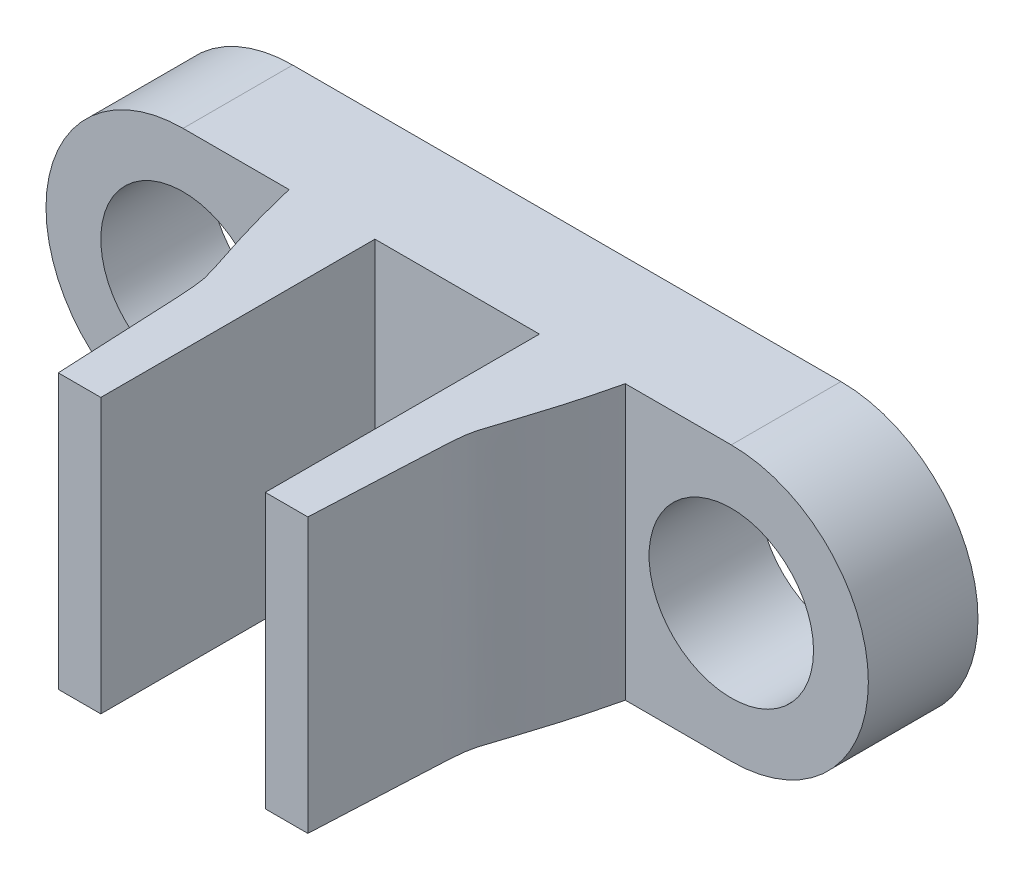
ISO-10303-21;
HEADER;
FILE_DESCRIPTION(('STEP AP214'),'2;1');
FILE_NAME('part.step','',(''),(''),'','','');
FILE_SCHEMA(('AUTOMOTIVE_DESIGN { 1 0 10303 214 1 1 1 1 }'));
ENDSEC;
DATA;
#1=APPLICATION_CONTEXT('core data for automotive mechanical design processes');
#2=APPLICATION_PROTOCOL_DEFINITION('international standard','automotive_design',2000,#1);
#3=PRODUCT_CONTEXT('',#1,'mechanical');
#4=PRODUCT('Part','Part','',(#3));
#5=PRODUCT_RELATED_PRODUCT_CATEGORY('part','',(#4));
#6=PRODUCT_DEFINITION_FORMATION('','',#4);
#7=PRODUCT_DEFINITION_CONTEXT('part definition',#1,'design');
#8=PRODUCT_DEFINITION('design','',#6,#7);
#9=PRODUCT_DEFINITION_SHAPE('','',#8);
#10=(LENGTH_UNIT() NAMED_UNIT(*) SI_UNIT(.MILLI.,.METRE.));
#11=(NAMED_UNIT(*) PLANE_ANGLE_UNIT() SI_UNIT($,.RADIAN.));
#12=(NAMED_UNIT(*) SI_UNIT($,.STERADIAN.) SOLID_ANGLE_UNIT());
#13=UNCERTAINTY_MEASURE_WITH_UNIT(LENGTH_MEASURE(1.E-05),#10,'distance_accuracy_value','');
#14=(GEOMETRIC_REPRESENTATION_CONTEXT(3) GLOBAL_UNCERTAINTY_ASSIGNED_CONTEXT((#13)) GLOBAL_UNIT_ASSIGNED_CONTEXT((#10,
#11,#12)) REPRESENTATION_CONTEXT('',''));
#15=CARTESIAN_POINT('',(0.,0.,0.));
#16=DIRECTION('',(0.,0.,1.));
#17=DIRECTION('',(1.,0.,0.));
#18=AXIS2_PLACEMENT_3D('',#15,#16,#17);
#19=CARTESIAN_POINT('',(5.,-9.93979523248615,2.));
#20=DIRECTION('',(0.,0.,1.));
#21=DIRECTION('',(1.,0.,0.));
#22=AXIS2_PLACEMENT_3D('',#19,#20,#21);
#23=PLANE('',#22);
#24=CARTESIAN_POINT('',(10.,2.5,2.));
#25=DIRECTION('',(0.,0.,1.));
#26=DIRECTION('',(1.,0.,0.));
#27=AXIS2_PLACEMENT_3D('',#24,#25,#26);
#28=CIRCLE('',#27,1.5);
#29=CARTESIAN_POINT('',(11.5,2.5,2.));
#30=VERTEX_POINT('',#29);
#31=EDGE_CURVE('E196',#30,#30,#28,.F.);
#32=ORIENTED_EDGE('',*,*,#31,.T.);
#33=EDGE_LOOP('',(#32));
#34=FACE_BOUND('',#33,.T.);
#35=DIRECTION('',(1.,0.,0.));
#36=VECTOR('',#35,1.);
#37=CARTESIAN_POINT('',(5.,5.,2.));
#38=LINE('',#37,#36);
#39=CARTESIAN_POINT('',(8.06674551606634,5.,2.));
#40=VERTEX_POINT('',#39);
#41=CARTESIAN_POINT('',(10.,5.,2.));
#42=VERTEX_POINT('',#41);
#43=EDGE_CURVE('E35',#40,#42,#38,.T.);
#44=ORIENTED_EDGE('',*,*,#43,.F.);
#45=DIRECTION('',(0.,-1.,0.));
#46=VECTOR('',#45,1.);
#47=CARTESIAN_POINT('',(8.06674551606634,5.,2.));
#48=LINE('',#47,#46);
#49=CARTESIAN_POINT('',(8.06674551606634,0.,2.));
#50=VERTEX_POINT('',#49);
#51=EDGE_CURVE('E161',#40,#50,#48,.T.);
#52=ORIENTED_EDGE('',*,*,#51,.T.);
#53=DIRECTION('',(1.,0.,0.));
#54=VECTOR('',#53,1.);
#55=CARTESIAN_POINT('',(5.,0.,2.));
#56=LINE('',#55,#54);
#57=CARTESIAN_POINT('',(10.,0.,2.));
#58=VERTEX_POINT('',#57);
#59=EDGE_CURVE('E249',#50,#58,#56,.T.);
#60=ORIENTED_EDGE('',*,*,#59,.T.);
#61=CARTESIAN_POINT('',(10.,2.5,2.));
#62=DIRECTION('',(0.,0.,1.));
#63=DIRECTION('',(1.,0.,0.));
#64=AXIS2_PLACEMENT_3D('',#61,#62,#63);
#65=CIRCLE('',#64,2.5);
#66=EDGE_CURVE('E236',#42,#58,#65,.F.);
#67=ORIENTED_EDGE('',*,*,#66,.F.);
#68=EDGE_LOOP('',(#44,#52,#60,#67));
#69=FACE_BOUND('',#68,.T.);
#70=ADVANCED_FACE('F31',(#34,#69),#23,.T.);
#71=CARTESIAN_POINT('',(3.5,0.,2.));
#72=VERTEX_POINT('',#71);
#73=CARTESIAN_POINT('',(6.5,0.,2.));
#74=VERTEX_POINT('',#73);
#75=EDGE_CURVE('E243',#72,#74,#56,.T.);
#76=ORIENTED_EDGE('',*,*,#75,.T.);
#77=DIRECTION('',(0.,-1.,0.));
#78=VECTOR('',#77,1.);
#79=CARTESIAN_POINT('',(6.5,5.,2.));
#80=LINE('',#79,#78);
#81=CARTESIAN_POINT('',(6.5,5.,2.));
#82=VERTEX_POINT('',#81);
#83=EDGE_CURVE('E56',#82,#74,#80,.T.);
#84=ORIENTED_EDGE('',*,*,#83,.F.);
#85=CARTESIAN_POINT('',(3.5,5.,2.));
#86=VERTEX_POINT('',#85);
#87=EDGE_CURVE('E129',#86,#82,#38,.T.);
#88=ORIENTED_EDGE('',*,*,#87,.F.);
#89=DIRECTION('',(0.,-1.,0.));
#90=VECTOR('',#89,1.);
#91=CARTESIAN_POINT('',(3.5,5.,2.));
#92=LINE('',#91,#90);
#93=EDGE_CURVE('E484',#86,#72,#92,.T.);
#94=ORIENTED_EDGE('',*,*,#93,.T.);
#95=EDGE_LOOP('',(#76,#84,#88,#94));
#96=FACE_BOUND('',#95,.T.);
#97=ADVANCED_FACE('F307',(#96),#23,.T.);
#98=CARTESIAN_POINT('',(5.,5.,2.));
#99=DIRECTION('',(0.,1.,0.));
#100=DIRECTION('',(-1.,0.,0.));
#101=AXIS2_PLACEMENT_3D('',#98,#99,#100);
#102=PLANE('',#101);
#103=DIRECTION('',(1.,0.,0.));
#104=VECTOR('',#103,1.);
#105=CARTESIAN_POINT('',(5.,5.,0.));
#106=LINE('',#105,#104);
#107=CARTESIAN_POINT('',(0.,5.,0.));
#108=VERTEX_POINT('',#107);
#109=CARTESIAN_POINT('',(10.,5.,0.));
#110=VERTEX_POINT('',#109);
#111=EDGE_CURVE('E229',#108,#110,#106,.T.);
#112=ORIENTED_EDGE('',*,*,#111,.F.);
#113=DIRECTION('',(0.,0.,-1.));
#114=VECTOR('',#113,1.);
#115=CARTESIAN_POINT('',(0.,5.,2.));
#116=LINE('',#115,#114);
#117=CARTESIAN_POINT('',(0.,5.,2.));
#118=VERTEX_POINT('',#117);
#119=EDGE_CURVE('E11',#118,#108,#116,.T.);
#120=ORIENTED_EDGE('',*,*,#119,.F.);
#121=CARTESIAN_POINT('',(1.93325448393367,5.,2.));
#122=VERTEX_POINT('',#121);
#123=EDGE_CURVE('E208',#118,#122,#38,.T.);
#124=ORIENTED_EDGE('',*,*,#123,.T.);
#125=CARTESIAN_POINT('',(1.93325448393367,5.,2.));
#126=CARTESIAN_POINT('',(2.17639992563824,5.,3.02764553538287));
#127=CARTESIAN_POINT('',(2.4338956799412,5.,3.71384394415481));
#128=CARTESIAN_POINT('',(2.62684127220932,5.,4.3777778213624));
#129=CARTESIAN_POINT('',(2.62348273197585,5.,5.09649635879953));
#130=CARTESIAN_POINT('',(2.72371487900341,5.,7.));
#131=B_SPLINE_CURVE_WITH_KNOTS('',3,(#125,#126,#127,#128,#129,#130),.UNSPECIFIED.,.F.,.F.,(4,1,
1,4),(0.,0.529324460452344,0.629324460452344,1.),.UNSPECIFIED.);
#132=CARTESIAN_POINT('',(2.72371487900342,5.,7.));
#133=VERTEX_POINT('',#132);
#134=EDGE_CURVE('E179',#122,#133,#131,.T.);
#135=ORIENTED_EDGE('',*,*,#134,.T.);
#136=DIRECTION('',(1.,0.,0.));
#137=VECTOR('',#136,1.);
#138=CARTESIAN_POINT('',(2.72371487900342,5.,7.));
#139=LINE('',#138,#137);
#140=CARTESIAN_POINT('',(3.5,5.,7.));
#141=VERTEX_POINT('',#140);
#142=EDGE_CURVE('E168',#133,#141,#139,.T.);
#143=ORIENTED_EDGE('',*,*,#142,.T.);
#144=DIRECTION('',(0.,0.,-1.));
#145=VECTOR('',#144,1.);
#146=CARTESIAN_POINT('',(3.5,5.,2.));
#147=LINE('',#146,#145);
#148=EDGE_CURVE('E483',#141,#86,#147,.T.);
#149=ORIENTED_EDGE('',*,*,#148,.T.);
#150=ORIENTED_EDGE('',*,*,#87,.T.);
#151=DIRECTION('',(0.,0.,1.));
#152=VECTOR('',#151,1.);
#153=CARTESIAN_POINT('',(6.5,5.,2.));
#154=LINE('',#153,#152);
#155=CARTESIAN_POINT('',(6.5,5.,7.));
#156=VERTEX_POINT('',#155);
#157=EDGE_CURVE('E122',#82,#156,#154,.T.);
#158=ORIENTED_EDGE('',*,*,#157,.T.);
#159=DIRECTION('',(1.,0.,0.));
#160=VECTOR('',#159,1.);
#161=CARTESIAN_POINT('',(7.27628512099659,5.,7.));
#162=LINE('',#161,#160);
#163=CARTESIAN_POINT('',(7.27628512099659,5.,7.));
#164=VERTEX_POINT('',#163);
#165=EDGE_CURVE('E127',#156,#164,#162,.T.);
#166=ORIENTED_EDGE('',*,*,#165,.T.);
#167=CARTESIAN_POINT('',(7.27628512099659,5.,7.));
#168=CARTESIAN_POINT('',(7.37651726802416,5.,5.09649635879953));
#169=CARTESIAN_POINT('',(7.37315872779069,5.,4.3777778213624));
#170=CARTESIAN_POINT('',(7.5661043200588,5.,3.71384394415481));
#171=CARTESIAN_POINT('',(7.82360007436176,5.,3.02764553538287));
#172=CARTESIAN_POINT('',(8.06674551606634,5.,2.));
#173=B_SPLINE_CURVE_WITH_KNOTS('',3,(#167,#168,#169,#170,#171,#172),.UNSPECIFIED.,.F.,.F.,(4,1,
1,4),(0.,0.370675539547656,0.470675539547656,1.),.UNSPECIFIED.);
#174=EDGE_CURVE('E131',#164,#40,#173,.T.);
#175=ORIENTED_EDGE('',*,*,#174,.T.);
#176=ORIENTED_EDGE('',*,*,#43,.T.);
#177=DIRECTION('',(0.,0.,-1.));
#178=VECTOR('',#177,1.);
#179=CARTESIAN_POINT('',(10.,5.,2.));
#180=LINE('',#179,#178);
#181=EDGE_CURVE('E215',#42,#110,#180,.T.);
#182=ORIENTED_EDGE('',*,*,#181,.T.);
#183=EDGE_LOOP('',(#112,#120,#124,#135,#143,#149,#150,#158,#166,#175,#176,#182));
#184=FACE_BOUND('',#183,.T.);
#185=ADVANCED_FACE('F125',(#184),#102,.T.);
#186=CARTESIAN_POINT('',(0.,2.5,2.));
#187=DIRECTION('',(0.,0.,-1.));
#188=DIRECTION('',(-1.,0.,0.));
#189=AXIS2_PLACEMENT_3D('',#186,#187,#188);
#190=CYLINDRICAL_SURFACE('',#189,2.5);
#191=CARTESIAN_POINT('',(0.,2.5,0.));
#192=DIRECTION('',(0.,0.,1.));
#193=DIRECTION('',(1.,0.,0.));
#194=AXIS2_PLACEMENT_3D('',#191,#192,#193);
#195=CIRCLE('',#194,2.5);
#196=CARTESIAN_POINT('',(0.,0.,0.));
#197=VERTEX_POINT('',#196);
#198=EDGE_CURVE('E226',#108,#197,#195,.T.);
#199=ORIENTED_EDGE('',*,*,#198,.T.);
#200=DIRECTION('',(0.,0.,-1.));
#201=VECTOR('',#200,1.);
#202=CARTESIAN_POINT('',(0.,0.,2.));
#203=LINE('',#202,#201);
#204=CARTESIAN_POINT('',(0.,0.,2.));
#205=VERTEX_POINT('',#204);
#206=EDGE_CURVE('E41',#205,#197,#203,.T.);
#207=ORIENTED_EDGE('',*,*,#206,.F.);
#208=CARTESIAN_POINT('',(0.,2.5,2.));
#209=DIRECTION('',(0.,0.,1.));
#210=DIRECTION('',(1.,0.,0.));
#211=AXIS2_PLACEMENT_3D('',#208,#209,#210);
#212=CIRCLE('',#211,2.5);
#213=EDGE_CURVE('E201',#118,#205,#212,.T.);
#214=ORIENTED_EDGE('',*,*,#213,.F.);
#215=ORIENTED_EDGE('',*,*,#119,.T.);
#216=EDGE_LOOP('',(#199,#207,#214,#215));
#217=FACE_BOUND('',#216,.T.);
#218=ADVANCED_FACE('F265',(#217),#190,.T.);
#219=CARTESIAN_POINT('',(5.,0.,2.));
#220=DIRECTION('',(0.,1.,0.));
#221=DIRECTION('',(-1.,0.,0.));
#222=AXIS2_PLACEMENT_3D('',#219,#220,#221);
#223=PLANE('',#222);
#224=DIRECTION('',(1.,0.,0.));
#225=VECTOR('',#224,1.);
#226=CARTESIAN_POINT('',(5.,0.,0.));
#227=LINE('',#226,#225);
#228=CARTESIAN_POINT('',(10.,0.,0.));
#229=VERTEX_POINT('',#228);
#230=EDGE_CURVE('E223',#197,#229,#227,.T.);
#231=ORIENTED_EDGE('',*,*,#230,.T.);
#232=DIRECTION('',(0.,0.,-1.));
#233=VECTOR('',#232,1.);
#234=CARTESIAN_POINT('',(10.,0.,2.));
#235=LINE('',#234,#233);
#236=EDGE_CURVE('E213',#58,#229,#235,.T.);
#237=ORIENTED_EDGE('',*,*,#236,.F.);
#238=ORIENTED_EDGE('',*,*,#59,.F.);
#239=CARTESIAN_POINT('',(7.27628512099659,0.,7.));
#240=CARTESIAN_POINT('',(7.37651726802416,0.,5.09649635879953));
#241=CARTESIAN_POINT('',(7.37315872779069,0.,4.3777778213624));
#242=CARTESIAN_POINT('',(7.5661043200588,0.,3.71384394415481));
#243=CARTESIAN_POINT('',(7.82360007436176,0.,3.02764553538287));
#244=CARTESIAN_POINT('',(8.06674551606634,0.,2.));
#245=B_SPLINE_CURVE_WITH_KNOTS('',3,(#239,#240,#241,#242,#243,#244),.UNSPECIFIED.,.F.,.F.,(4,1,
1,4),(0.,0.370675539547656,0.470675539547656,1.),.UNSPECIFIED.);
#246=CARTESIAN_POINT('',(7.27628512099659,0.,7.));
#247=VERTEX_POINT('',#246);
#248=EDGE_CURVE('E149',#247,#50,#245,.T.);
#249=ORIENTED_EDGE('',*,*,#248,.F.);
#250=DIRECTION('',(1.,0.,0.));
#251=VECTOR('',#250,1.);
#252=CARTESIAN_POINT('',(7.27628512099659,0.,7.));
#253=LINE('',#252,#251);
#254=CARTESIAN_POINT('',(6.5,0.,7.));
#255=VERTEX_POINT('',#254);
#256=EDGE_CURVE('E158',#255,#247,#253,.T.);
#257=ORIENTED_EDGE('',*,*,#256,.F.);
#258=DIRECTION('',(0.,0.,1.));
#259=VECTOR('',#258,1.);
#260=CARTESIAN_POINT('',(6.5,0.,2.));
#261=LINE('',#260,#259);
#262=EDGE_CURVE('E137',#74,#255,#261,.T.);
#263=ORIENTED_EDGE('',*,*,#262,.F.);
#264=ORIENTED_EDGE('',*,*,#75,.F.);
#265=DIRECTION('',(0.,0.,-1.));
#266=VECTOR('',#265,1.);
#267=CARTESIAN_POINT('',(3.5,0.,2.));
#268=LINE('',#267,#266);
#269=CARTESIAN_POINT('',(3.5,0.,7.));
#270=VERTEX_POINT('',#269);
#271=EDGE_CURVE('E182',#270,#72,#268,.T.);
#272=ORIENTED_EDGE('',*,*,#271,.F.);
#273=DIRECTION('',(1.,0.,0.));
#274=VECTOR('',#273,1.);
#275=CARTESIAN_POINT('',(2.72371487900342,0.,7.));
#276=LINE('',#275,#274);
#277=CARTESIAN_POINT('',(2.72371487900342,0.,7.));
#278=VERTEX_POINT('',#277);
#279=EDGE_CURVE('E271',#278,#270,#276,.T.);
#280=ORIENTED_EDGE('',*,*,#279,.F.);
#281=CARTESIAN_POINT('',(1.93325448393367,0.,2.));
#282=CARTESIAN_POINT('',(2.17639992563824,0.,3.02764553538287));
#283=CARTESIAN_POINT('',(2.4338956799412,0.,3.71384394415481));
#284=CARTESIAN_POINT('',(2.62684127220932,0.,4.3777778213624));
#285=CARTESIAN_POINT('',(2.62348273197585,0.,5.09649635879953));
#286=CARTESIAN_POINT('',(2.72371487900341,0.,7.));
#287=B_SPLINE_CURVE_WITH_KNOTS('',3,(#281,#282,#283,#284,#285,#286),.UNSPECIFIED.,.F.,.F.,(4,1,
1,4),(0.,0.529324460452344,0.629324460452344,1.),.UNSPECIFIED.);
#288=CARTESIAN_POINT('',(1.93325448393367,0.,2.));
#289=VERTEX_POINT('',#288);
#290=EDGE_CURVE('E163',#289,#278,#287,.T.);
#291=ORIENTED_EDGE('',*,*,#290,.F.);
#292=EDGE_CURVE('E238',#205,#289,#56,.T.);
#293=ORIENTED_EDGE('',*,*,#292,.F.);
#294=ORIENTED_EDGE('',*,*,#206,.T.);
#295=EDGE_LOOP('',(#231,#237,#238,#249,#257,#263,#264,#272,#280,#291,#293,#294));
#296=FACE_BOUND('',#295,.T.);
#297=ADVANCED_FACE('F268',(#296),#223,.F.);
#298=CARTESIAN_POINT('',(10.,2.5,2.));
#299=DIRECTION('',(0.,0.,-1.));
#300=DIRECTION('',(-1.,0.,0.));
#301=AXIS2_PLACEMENT_3D('',#298,#299,#300);
#302=CYLINDRICAL_SURFACE('',#301,2.5);
#303=CARTESIAN_POINT('',(10.,2.5,0.));
#304=DIRECTION('',(0.,0.,1.));
#305=DIRECTION('',(1.,0.,0.));
#306=AXIS2_PLACEMENT_3D('',#303,#304,#305);
#307=CIRCLE('',#306,2.5);
#308=EDGE_CURVE('E220',#110,#229,#307,.F.);
#309=ORIENTED_EDGE('',*,*,#308,.F.);
#310=ORIENTED_EDGE('',*,*,#181,.F.);
#311=ORIENTED_EDGE('',*,*,#66,.T.);
#312=ORIENTED_EDGE('',*,*,#236,.T.);
#313=EDGE_LOOP('',(#309,#310,#311,#312));
#314=FACE_BOUND('',#313,.T.);
#315=ADVANCED_FACE('F281',(#314),#302,.T.);
#316=CARTESIAN_POINT('',(10.,2.5,2.));
#317=DIRECTION('',(0.,0.,-1.));
#318=DIRECTION('',(-1.,0.,0.));
#319=AXIS2_PLACEMENT_3D('',#316,#317,#318);
#320=CYLINDRICAL_SURFACE('',#319,1.5);
#321=ORIENTED_EDGE('',*,*,#31,.F.);
#322=EDGE_LOOP('',(#321));
#323=FACE_BOUND('',#322,.T.);
#324=CARTESIAN_POINT('',(10.,2.5,0.));
#325=DIRECTION('',(0.,0.,1.));
#326=DIRECTION('',(1.,0.,0.));
#327=AXIS2_PLACEMENT_3D('',#324,#325,#326);
#328=CIRCLE('',#327,1.5);
#329=CARTESIAN_POINT('',(11.5,2.5,0.));
#330=VERTEX_POINT('',#329);
#331=EDGE_CURVE('E189',#330,#330,#328,.F.);
#332=ORIENTED_EDGE('',*,*,#331,.T.);
#333=EDGE_LOOP('',(#332));
#334=FACE_BOUND('',#333,.T.);
#335=ADVANCED_FACE('F33',(#323,#334),#320,.F.);
#336=CARTESIAN_POINT('',(0.,2.5,2.));
#337=DIRECTION('',(0.,0.,-1.));
#338=DIRECTION('',(-1.,0.,0.));
#339=AXIS2_PLACEMENT_3D('',#336,#337,#338);
#340=CYLINDRICAL_SURFACE('',#339,1.5);
#341=CARTESIAN_POINT('',(0.,2.5,2.));
#342=DIRECTION('',(0.,0.,1.));
#343=DIRECTION('',(1.,0.,0.));
#344=AXIS2_PLACEMENT_3D('',#341,#342,#343);
#345=CIRCLE('',#344,1.5);
#346=CARTESIAN_POINT('',(1.5,2.5,2.));
#347=VERTEX_POINT('',#346);
#348=EDGE_CURVE('E217',#347,#347,#345,.T.);
#349=ORIENTED_EDGE('',*,*,#348,.T.);
#350=EDGE_LOOP('',(#349));
#351=FACE_BOUND('',#350,.T.);
#352=CARTESIAN_POINT('',(0.,2.5,0.));
#353=DIRECTION('',(0.,0.,1.));
#354=DIRECTION('',(1.,0.,0.));
#355=AXIS2_PLACEMENT_3D('',#352,#353,#354);
#356=CIRCLE('',#355,1.5);
#357=CARTESIAN_POINT('',(1.5,2.5,0.));
#358=VERTEX_POINT('',#357);
#359=EDGE_CURVE('E198',#358,#358,#356,.T.);
#360=ORIENTED_EDGE('',*,*,#359,.F.);
#361=EDGE_LOOP('',(#360));
#362=FACE_BOUND('',#361,.T.);
#363=ADVANCED_FACE('F314',(#351,#362),#340,.F.);
#364=DIRECTION('',(0.,-1.,0.));
#365=VECTOR('',#364,1.);
#366=CARTESIAN_POINT('',(1.93325448393367,5.,2.));
#367=LINE('',#366,#365);
#368=EDGE_CURVE('E185',#122,#289,#367,.T.);
#369=ORIENTED_EDGE('',*,*,#368,.F.);
#370=ORIENTED_EDGE('',*,*,#123,.F.);
#371=ORIENTED_EDGE('',*,*,#213,.T.);
#372=ORIENTED_EDGE('',*,*,#292,.T.);
#373=EDGE_LOOP('',(#369,#370,#371,#372));
#374=FACE_BOUND('',#373,.T.);
#375=ORIENTED_EDGE('',*,*,#348,.F.);
#376=EDGE_LOOP('',(#375));
#377=FACE_BOUND('',#376,.T.);
#378=ADVANCED_FACE('F262',(#374,#377),#23,.T.);
#379=CARTESIAN_POINT('',(5.,-9.93979523248615,0.));
#380=DIRECTION('',(0.,0.,1.));
#381=DIRECTION('',(1.,0.,0.));
#382=AXIS2_PLACEMENT_3D('',#379,#380,#381);
#383=PLANE('',#382);
#384=ORIENTED_EDGE('',*,*,#331,.F.);
#385=EDGE_LOOP('',(#384));
#386=FACE_BOUND('',#385,.T.);
#387=ORIENTED_EDGE('',*,*,#111,.T.);
#388=ORIENTED_EDGE('',*,*,#308,.T.);
#389=ORIENTED_EDGE('',*,*,#230,.F.);
#390=ORIENTED_EDGE('',*,*,#198,.F.);
#391=EDGE_LOOP('',(#387,#388,#389,#390));
#392=FACE_BOUND('',#391,.T.);
#393=ORIENTED_EDGE('',*,*,#359,.T.);
#394=EDGE_LOOP('',(#393));
#395=FACE_BOUND('',#394,.T.);
#396=ADVANCED_FACE('F276',(#386,#392,#395),#383,.F.);
#397=DIRECTION('',(0.,-1.,0.));
#398=VECTOR('',#397,1.);
#399=SURFACE_OF_LINEAR_EXTRUSION('',#131,#398);
#400=ORIENTED_EDGE('',*,*,#290,.T.);
#401=DIRECTION('',(0.,-1.,0.));
#402=VECTOR('',#401,1.);
#403=CARTESIAN_POINT('',(2.72371487900342,5.,7.));
#404=LINE('',#403,#402);
#405=EDGE_CURVE('E190',#133,#278,#404,.T.);
#406=ORIENTED_EDGE('',*,*,#405,.F.);
#407=ORIENTED_EDGE('',*,*,#134,.F.);
#408=ORIENTED_EDGE('',*,*,#368,.T.);
#409=EDGE_LOOP('',(#400,#406,#407,#408));
#410=FACE_BOUND('',#409,.T.);
#411=ADVANCED_FACE('F175',(#410),#399,.F.);
#412=CARTESIAN_POINT('',(2.72371487900342,5.,7.));
#413=DIRECTION('',(0.,0.,-1.));
#414=DIRECTION('',(-1.,0.,0.));
#415=AXIS2_PLACEMENT_3D('',#412,#413,#414);
#416=PLANE('',#415);
#417=ORIENTED_EDGE('',*,*,#279,.T.);
#418=DIRECTION('',(0.,-1.,0.));
#419=VECTOR('',#418,1.);
#420=CARTESIAN_POINT('',(3.5,5.,7.));
#421=LINE('',#420,#419);
#422=EDGE_CURVE('E480',#141,#270,#421,.T.);
#423=ORIENTED_EDGE('',*,*,#422,.F.);
#424=ORIENTED_EDGE('',*,*,#142,.F.);
#425=ORIENTED_EDGE('',*,*,#405,.T.);
#426=EDGE_LOOP('',(#417,#423,#424,#425));
#427=FACE_BOUND('',#426,.T.);
#428=ADVANCED_FACE('F299',(#427),#416,.F.);
#429=CARTESIAN_POINT('',(3.5,5.,2.));
#430=DIRECTION('',(-1.,0.,0.));
#431=DIRECTION('',(0.,0.,1.));
#432=AXIS2_PLACEMENT_3D('',#429,#430,#431);
#433=PLANE('',#432);
#434=ORIENTED_EDGE('',*,*,#271,.T.);
#435=ORIENTED_EDGE('',*,*,#93,.F.);
#436=ORIENTED_EDGE('',*,*,#148,.F.);
#437=ORIENTED_EDGE('',*,*,#422,.T.);
#438=EDGE_LOOP('',(#434,#435,#436,#437));
#439=FACE_BOUND('',#438,.T.);
#440=ADVANCED_FACE('F296',(#439),#433,.F.);
#441=DIRECTION('',(0.,-1.,0.));
#442=VECTOR('',#441,1.);
#443=SURFACE_OF_LINEAR_EXTRUSION('',#173,#442);
#444=ORIENTED_EDGE('',*,*,#248,.T.);
#445=ORIENTED_EDGE('',*,*,#51,.F.);
#446=ORIENTED_EDGE('',*,*,#174,.F.);
#447=DIRECTION('',(0.,-1.,0.));
#448=VECTOR('',#447,1.);
#449=CARTESIAN_POINT('',(7.27628512099659,5.,7.));
#450=LINE('',#449,#448);
#451=EDGE_CURVE('E140',#164,#247,#450,.T.);
#452=ORIENTED_EDGE('',*,*,#451,.T.);
#453=EDGE_LOOP('',(#444,#445,#446,#452));
#454=FACE_BOUND('',#453,.T.);
#455=ADVANCED_FACE('F285',(#454),#443,.F.);
#456=CARTESIAN_POINT('',(6.5,5.,2.));
#457=DIRECTION('',(1.,0.,0.));
#458=DIRECTION('',(0.,0.,-1.));
#459=AXIS2_PLACEMENT_3D('',#456,#457,#458);
#460=PLANE('',#459);
#461=ORIENTED_EDGE('',*,*,#262,.T.);
#462=DIRECTION('',(0.,-1.,0.));
#463=VECTOR('',#462,1.);
#464=CARTESIAN_POINT('',(6.5,5.,7.));
#465=LINE('',#464,#463);
#466=EDGE_CURVE('E134',#156,#255,#465,.T.);
#467=ORIENTED_EDGE('',*,*,#466,.F.);
#468=ORIENTED_EDGE('',*,*,#157,.F.);
#469=ORIENTED_EDGE('',*,*,#83,.T.);
#470=EDGE_LOOP('',(#461,#467,#468,#469));
#471=FACE_BOUND('',#470,.T.);
#472=ADVANCED_FACE('F135',(#471),#460,.F.);
#473=CARTESIAN_POINT('',(7.27628512099659,5.,7.));
#474=DIRECTION('',(0.,0.,-1.));
#475=DIRECTION('',(-1.,0.,0.));
#476=AXIS2_PLACEMENT_3D('',#473,#474,#475);
#477=PLANE('',#476);
#478=ORIENTED_EDGE('',*,*,#256,.T.);
#479=ORIENTED_EDGE('',*,*,#451,.F.);
#480=ORIENTED_EDGE('',*,*,#165,.F.);
#481=ORIENTED_EDGE('',*,*,#466,.T.);
#482=EDGE_LOOP('',(#478,#479,#480,#481));
#483=FACE_BOUND('',#482,.T.);
#484=ADVANCED_FACE('F142',(#483),#477,.F.);
#485=CLOSED_SHELL('',(#70,#97,#185,#218,#297,#315,#335,#363,#378,#396,#411,#428,#440,#455,#472,#484));
#486=MANIFOLD_SOLID_BREP('B2',#485);
#487=ADVANCED_BREP_SHAPE_REPRESENTATION('',(#18,#486),#14);
#488=SHAPE_DEFINITION_REPRESENTATION(#9,#487);
ENDSEC;
END-ISO-10303-21;
